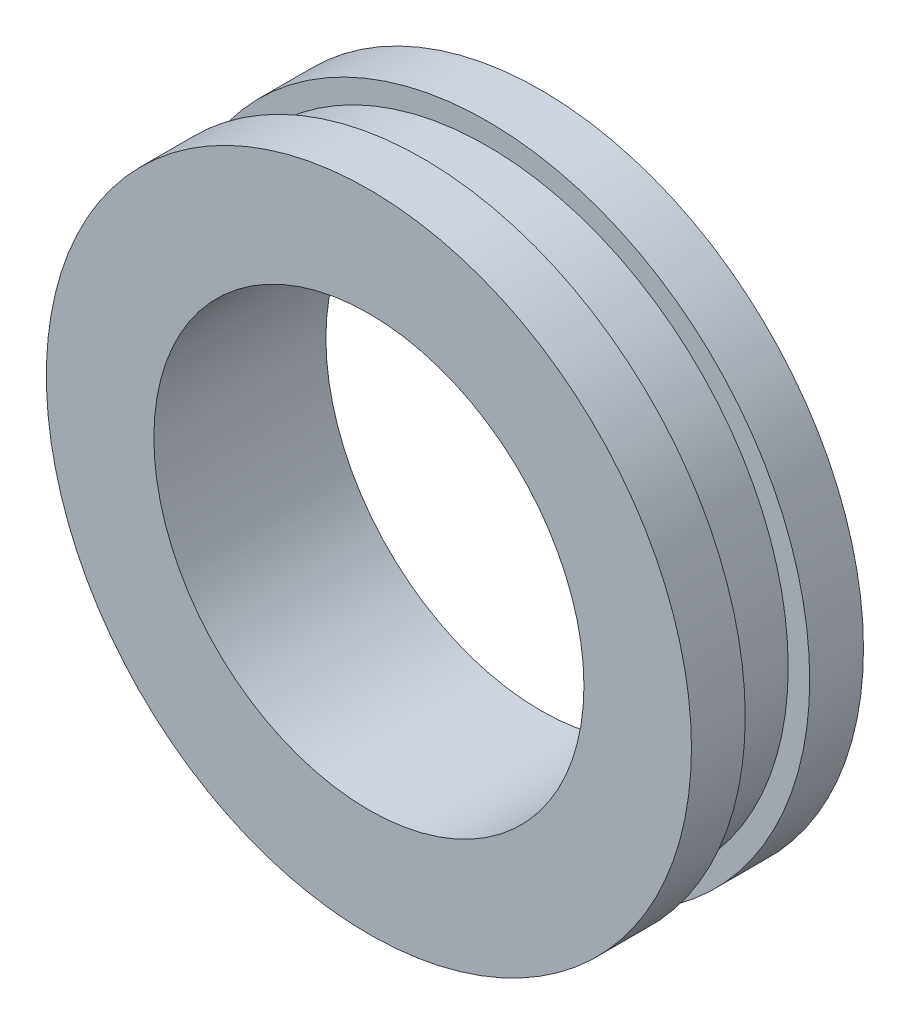
ISO-10303-21;
HEADER;
FILE_DESCRIPTION(('STEP AP214'),'2;1');
FILE_NAME('part.step','',(''),(''),'','','');
FILE_SCHEMA(('AUTOMOTIVE_DESIGN { 1 0 10303 214 1 1 1 1 }'));
ENDSEC;
DATA;
#1=APPLICATION_CONTEXT('core data for automotive mechanical design processes');
#2=APPLICATION_PROTOCOL_DEFINITION('international standard','automotive_design',2000,#1);
#3=PRODUCT_CONTEXT('',#1,'mechanical');
#4=PRODUCT('Part','Part','',(#3));
#5=PRODUCT_RELATED_PRODUCT_CATEGORY('part','',(#4));
#6=PRODUCT_DEFINITION_FORMATION('','',#4);
#7=PRODUCT_DEFINITION_CONTEXT('part definition',#1,'design');
#8=PRODUCT_DEFINITION('design','',#6,#7);
#9=PRODUCT_DEFINITION_SHAPE('','',#8);
#10=(LENGTH_UNIT() NAMED_UNIT(*) SI_UNIT(.MILLI.,.METRE.));
#11=(NAMED_UNIT(*) PLANE_ANGLE_UNIT() SI_UNIT($,.RADIAN.));
#12=(NAMED_UNIT(*) SI_UNIT($,.STERADIAN.) SOLID_ANGLE_UNIT());
#13=UNCERTAINTY_MEASURE_WITH_UNIT(LENGTH_MEASURE(1.E-05),#10,'distance_accuracy_value','');
#14=(GEOMETRIC_REPRESENTATION_CONTEXT(3) GLOBAL_UNCERTAINTY_ASSIGNED_CONTEXT((#13)) GLOBAL_UNIT_ASSIGNED_CONTEXT((#10,
#11,#12)) REPRESENTATION_CONTEXT('',''));
#15=CARTESIAN_POINT('',(0.,0.,0.));
#16=DIRECTION('',(0.,0.,1.));
#17=DIRECTION('',(1.,0.,0.));
#18=AXIS2_PLACEMENT_3D('',#15,#16,#17);
#19=CARTESIAN_POINT('',(0.,7.5,2.));
#20=DIRECTION('',(0.,0.,-1.));
#21=DIRECTION('',(-1.,0.,0.));
#22=AXIS2_PLACEMENT_3D('',#19,#20,#21);
#23=PLANE('',#22);
#24=CARTESIAN_POINT('',(0.,0.,2.));
#25=DIRECTION('',(0.,0.,1.));
#26=DIRECTION('',(1.,0.,0.));
#27=AXIS2_PLACEMENT_3D('',#24,#25,#26);
#28=CIRCLE('',#27,5.);
#29=CARTESIAN_POINT('',(5.,0.,2.));
#30=VERTEX_POINT('',#29);
#31=EDGE_CURVE('E10',#30,#30,#28,.T.);
#32=ORIENTED_EDGE('',*,*,#31,.F.);
#33=EDGE_LOOP('',(#32));
#34=FACE_BOUND('',#33,.T.);
#35=CARTESIAN_POINT('',(0.,0.,2.));
#36=DIRECTION('',(0.,0.,1.));
#37=DIRECTION('',(1.,0.,0.));
#38=AXIS2_PLACEMENT_3D('',#35,#36,#37);
#39=CIRCLE('',#38,7.5);
#40=CARTESIAN_POINT('',(7.5,0.,2.));
#41=VERTEX_POINT('',#40);
#42=EDGE_CURVE('E58',#41,#41,#39,.T.);
#43=ORIENTED_EDGE('',*,*,#42,.T.);
#44=EDGE_LOOP('',(#43));
#45=FACE_BOUND('',#44,.T.);
#46=ADVANCED_FACE('F30',(#34,#45),#23,.F.);
#47=CARTESIAN_POINT('',(0.,0.,17.6913394855871));
#48=DIRECTION('',(0.,0.,1.));
#49=DIRECTION('',(1.,0.,0.));
#50=AXIS2_PLACEMENT_3D('',#47,#48,#49);
#51=CYLINDRICAL_SURFACE('',#50,5.);
#52=CARTESIAN_POINT('',(0.,0.,-2.));
#53=DIRECTION('',(0.,0.,1.));
#54=DIRECTION('',(1.,0.,0.));
#55=AXIS2_PLACEMENT_3D('',#52,#53,#54);
#56=CIRCLE('',#55,5.);
#57=CARTESIAN_POINT('',(5.,0.,-2.));
#58=VERTEX_POINT('',#57);
#59=EDGE_CURVE('E36',#58,#58,#56,.T.);
#60=ORIENTED_EDGE('',*,*,#59,.F.);
#61=EDGE_LOOP('',(#60));
#62=FACE_BOUND('',#61,.T.);
#63=ORIENTED_EDGE('',*,*,#31,.T.);
#64=EDGE_LOOP('',(#63));
#65=FACE_BOUND('',#64,.T.);
#66=ADVANCED_FACE('F95',(#62,#65),#51,.F.);
#67=CARTESIAN_POINT('',(0.,5.,-2.));
#68=DIRECTION('',(0.,0.,1.));
#69=DIRECTION('',(1.,0.,0.));
#70=AXIS2_PLACEMENT_3D('',#67,#68,#69);
#71=PLANE('',#70);
#72=CARTESIAN_POINT('',(0.,0.,-2.));
#73=DIRECTION('',(0.,0.,1.));
#74=DIRECTION('',(1.,0.,0.));
#75=AXIS2_PLACEMENT_3D('',#72,#73,#74);
#76=CIRCLE('',#75,7.5);
#77=CARTESIAN_POINT('',(7.5,0.,-2.));
#78=VERTEX_POINT('',#77);
#79=EDGE_CURVE('E40',#78,#78,#76,.T.);
#80=ORIENTED_EDGE('',*,*,#79,.F.);
#81=EDGE_LOOP('',(#80));
#82=FACE_BOUND('',#81,.T.);
#83=ORIENTED_EDGE('',*,*,#59,.T.);
#84=EDGE_LOOP('',(#83));
#85=FACE_BOUND('',#84,.T.);
#86=ADVANCED_FACE('F90',(#82,#85),#71,.F.);
#87=CARTESIAN_POINT('',(0.,0.,17.6913394855871));
#88=DIRECTION('',(0.,0.,1.));
#89=DIRECTION('',(1.,0.,0.));
#90=AXIS2_PLACEMENT_3D('',#87,#88,#89);
#91=CYLINDRICAL_SURFACE('',#90,7.5);
#92=CARTESIAN_POINT('',(0.,0.,-0.749999999999997));
#93=DIRECTION('',(0.,0.,1.));
#94=DIRECTION('',(1.,0.,0.));
#95=AXIS2_PLACEMENT_3D('',#92,#93,#94);
#96=CIRCLE('',#95,7.5);
#97=CARTESIAN_POINT('',(7.5,0.,-0.749999999999997));
#98=VERTEX_POINT('',#97);
#99=EDGE_CURVE('E44',#98,#98,#96,.T.);
#100=ORIENTED_EDGE('',*,*,#99,.F.);
#101=EDGE_LOOP('',(#100));
#102=FACE_BOUND('',#101,.T.);
#103=ORIENTED_EDGE('',*,*,#79,.T.);
#104=EDGE_LOOP('',(#103));
#105=FACE_BOUND('',#104,.T.);
#106=ADVANCED_FACE('F84',(#102,#105),#91,.T.);
#107=CARTESIAN_POINT('',(0.,7.5,-0.749999999999997));
#108=DIRECTION('',(0.,0.,-1.));
#109=DIRECTION('',(-1.,0.,0.));
#110=AXIS2_PLACEMENT_3D('',#107,#108,#109);
#111=PLANE('',#110);
#112=CARTESIAN_POINT('',(0.,0.,-0.749999999999997));
#113=DIRECTION('',(0.,0.,1.));
#114=DIRECTION('',(1.,0.,0.));
#115=AXIS2_PLACEMENT_3D('',#112,#113,#114);
#116=CIRCLE('',#115,7.);
#117=CARTESIAN_POINT('',(7.,0.,-0.749999999999997));
#118=VERTEX_POINT('',#117);
#119=EDGE_CURVE('E49',#118,#118,#116,.T.);
#120=ORIENTED_EDGE('',*,*,#119,.F.);
#121=EDGE_LOOP('',(#120));
#122=FACE_BOUND('',#121,.T.);
#123=ORIENTED_EDGE('',*,*,#99,.T.);
#124=EDGE_LOOP('',(#123));
#125=FACE_BOUND('',#124,.T.);
#126=ADVANCED_FACE('F78',(#122,#125),#111,.F.);
#127=CARTESIAN_POINT('',(0.,0.,17.6913394855871));
#128=DIRECTION('',(0.,0.,1.));
#129=DIRECTION('',(1.,0.,0.));
#130=AXIS2_PLACEMENT_3D('',#127,#128,#129);
#131=CYLINDRICAL_SURFACE('',#130,7.);
#132=CARTESIAN_POINT('',(0.,0.,0.749999999999997));
#133=DIRECTION('',(0.,0.,1.));
#134=DIRECTION('',(1.,0.,0.));
#135=AXIS2_PLACEMENT_3D('',#132,#133,#134);
#136=CIRCLE('',#135,7.);
#137=CARTESIAN_POINT('',(7.,0.,0.749999999999997));
#138=VERTEX_POINT('',#137);
#139=EDGE_CURVE('E52',#138,#138,#136,.T.);
#140=ORIENTED_EDGE('',*,*,#139,.F.);
#141=EDGE_LOOP('',(#140));
#142=FACE_BOUND('',#141,.T.);
#143=ORIENTED_EDGE('',*,*,#119,.T.);
#144=EDGE_LOOP('',(#143));
#145=FACE_BOUND('',#144,.T.);
#146=ADVANCED_FACE('F72',(#142,#145),#131,.T.);
#147=CARTESIAN_POINT('',(0.,7.,0.749999999999997));
#148=DIRECTION('',(0.,0.,1.));
#149=DIRECTION('',(1.,0.,0.));
#150=AXIS2_PLACEMENT_3D('',#147,#148,#149);
#151=PLANE('',#150);
#152=CARTESIAN_POINT('',(0.,0.,0.749999999999997));
#153=DIRECTION('',(0.,0.,1.));
#154=DIRECTION('',(1.,0.,0.));
#155=AXIS2_PLACEMENT_3D('',#152,#153,#154);
#156=CIRCLE('',#155,7.5);
#157=CARTESIAN_POINT('',(7.5,0.,0.749999999999997));
#158=VERTEX_POINT('',#157);
#159=EDGE_CURVE('E55',#158,#158,#156,.T.);
#160=ORIENTED_EDGE('',*,*,#159,.F.);
#161=EDGE_LOOP('',(#160));
#162=FACE_BOUND('',#161,.T.);
#163=ORIENTED_EDGE('',*,*,#139,.T.);
#164=EDGE_LOOP('',(#163));
#165=FACE_BOUND('',#164,.T.);
#166=ADVANCED_FACE('F66',(#162,#165),#151,.F.);
#167=CARTESIAN_POINT('',(0.,0.,17.6913394855871));
#168=DIRECTION('',(0.,0.,1.));
#169=DIRECTION('',(1.,0.,0.));
#170=AXIS2_PLACEMENT_3D('',#167,#168,#169);
#171=CYLINDRICAL_SURFACE('',#170,7.5);
#172=ORIENTED_EDGE('',*,*,#42,.F.);
#173=EDGE_LOOP('',(#172));
#174=FACE_BOUND('',#173,.T.);
#175=ORIENTED_EDGE('',*,*,#159,.T.);
#176=EDGE_LOOP('',(#175));
#177=FACE_BOUND('',#176,.T.);
#178=ADVANCED_FACE('F63',(#174,#177),#171,.T.);
#179=CLOSED_SHELL('',(#46,#66,#86,#106,#126,#146,#166,#178));
#180=MANIFOLD_SOLID_BREP('B2',#179);
#181=ADVANCED_BREP_SHAPE_REPRESENTATION('',(#18,#180),#14);
#182=SHAPE_DEFINITION_REPRESENTATION(#9,#181);
ENDSEC;
END-ISO-10303-21;
